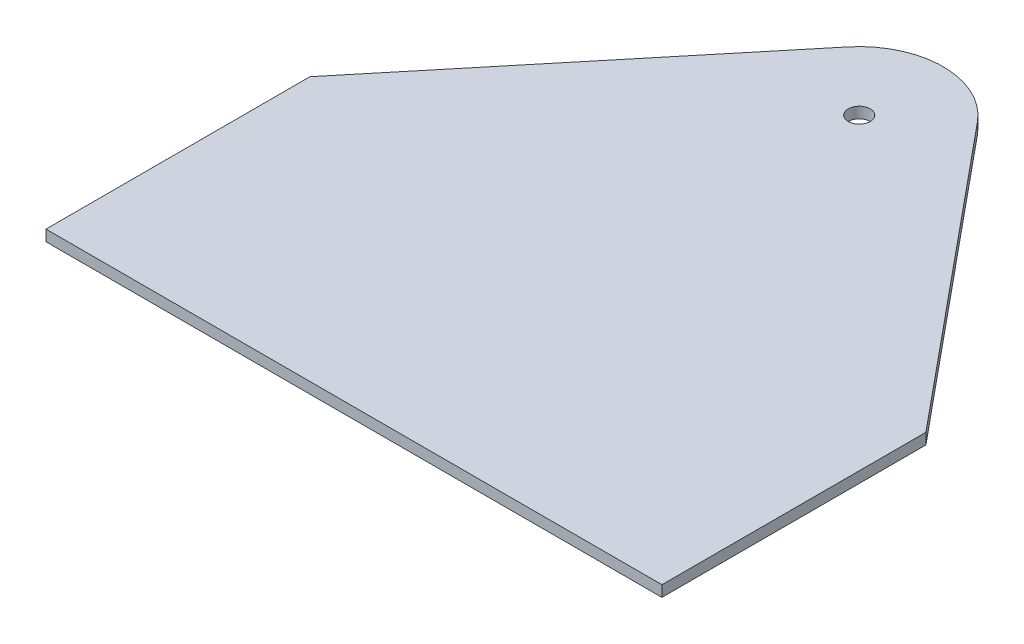
ISO-10303-21;
HEADER;
FILE_DESCRIPTION(('STEP AP214'),'2;1');
FILE_NAME('part.step','',(''),(''),'','','');
FILE_SCHEMA(('AUTOMOTIVE_DESIGN { 1 0 10303 214 1 1 1 1 }'));
ENDSEC;
DATA;
#1=APPLICATION_CONTEXT('core data for automotive mechanical design processes');
#2=APPLICATION_PROTOCOL_DEFINITION('international standard','automotive_design',2000,#1);
#3=PRODUCT_CONTEXT('',#1,'mechanical');
#4=PRODUCT('Part','Part','',(#3));
#5=PRODUCT_RELATED_PRODUCT_CATEGORY('part','',(#4));
#6=PRODUCT_DEFINITION_FORMATION('','',#4);
#7=PRODUCT_DEFINITION_CONTEXT('part definition',#1,'design');
#8=PRODUCT_DEFINITION('design','',#6,#7);
#9=PRODUCT_DEFINITION_SHAPE('','',#8);
#10=(LENGTH_UNIT() NAMED_UNIT(*) SI_UNIT(.MILLI.,.METRE.));
#11=(NAMED_UNIT(*) PLANE_ANGLE_UNIT() SI_UNIT($,.RADIAN.));
#12=(NAMED_UNIT(*) SI_UNIT($,.STERADIAN.) SOLID_ANGLE_UNIT());
#13=UNCERTAINTY_MEASURE_WITH_UNIT(LENGTH_MEASURE(1.E-05),#10,'distance_accuracy_value','');
#14=(GEOMETRIC_REPRESENTATION_CONTEXT(3) GLOBAL_UNCERTAINTY_ASSIGNED_CONTEXT((#13)) GLOBAL_UNIT_ASSIGNED_CONTEXT((#10,
#11,#12)) REPRESENTATION_CONTEXT('',''));
#15=CARTESIAN_POINT('',(0.,0.,0.));
#16=DIRECTION('',(0.,0.,1.));
#17=DIRECTION('',(1.,0.,0.));
#18=AXIS2_PLACEMENT_3D('',#15,#16,#17);
#19=CARTESIAN_POINT('',(0.,3.175,-145.86307345283));
#20=DIRECTION('',(0.,-1.,0.));
#21=DIRECTION('',(0.,0.,-1.));
#22=AXIS2_PLACEMENT_3D('',#19,#20,#21);
#23=PLANE('',#22);
#24=DIRECTION('',(0.,0.,-1.));
#25=VECTOR('',#24,1.);
#26=CARTESIAN_POINT('',(88.9,3.175,0.));
#27=LINE('',#26,#25);
#28=CARTESIAN_POINT('',(88.9,3.175,0.));
#29=VERTEX_POINT('',#28);
#30=CARTESIAN_POINT('',(88.9,3.175,-76.2));
#31=VERTEX_POINT('',#30);
#32=EDGE_CURVE('E128',#29,#31,#27,.T.);
#33=ORIENTED_EDGE('',*,*,#32,.T.);
#34=DIRECTION('',(-0.636363636363636,0.,-0.77138921583987));
#35=VECTOR('',#34,1.);
#36=CARTESIAN_POINT('',(18.7026821694994,3.175,-161.291999072665));
#37=LINE('',#36,#35);
#38=CARTESIAN_POINT('',(18.7026821694994,3.175,-161.291999072665));
#39=VERTEX_POINT('',#38);
#40=EDGE_CURVE('E86',#31,#39,#37,.T.);
#41=ORIENTED_EDGE('',*,*,#40,.T.);
#42=CARTESIAN_POINT('',(0.,3.175,-145.86307345283));
#43=DIRECTION('',(0.,1.,0.));
#44=DIRECTION('',(0.,0.,-1.));
#45=AXIS2_PLACEMENT_3D('',#42,#43,#44);
#46=CIRCLE('',#45,24.2454545454546);
#47=CARTESIAN_POINT('',(-18.7026821694994,3.175,-161.291999072665));
#48=VERTEX_POINT('',#47);
#49=EDGE_CURVE('E99',#39,#48,#46,.T.);
#50=ORIENTED_EDGE('',*,*,#49,.T.);
#51=DIRECTION('',(-0.636363636363636,0.,0.77138921583987));
#52=VECTOR('',#51,1.);
#53=CARTESIAN_POINT('',(-88.9,3.175,-76.2));
#54=LINE('',#53,#52);
#55=CARTESIAN_POINT('',(-88.9,3.175,-76.2));
#56=VERTEX_POINT('',#55);
#57=EDGE_CURVE('E93',#48,#56,#54,.T.);
#58=ORIENTED_EDGE('',*,*,#57,.T.);
#59=DIRECTION('',(0.,0.,1.));
#60=VECTOR('',#59,1.);
#61=CARTESIAN_POINT('',(-88.9,3.175,0.));
#62=LINE('',#61,#60);
#63=CARTESIAN_POINT('',(-88.9,3.175,0.));
#64=VERTEX_POINT('',#63);
#65=EDGE_CURVE('E97',#56,#64,#62,.T.);
#66=ORIENTED_EDGE('',*,*,#65,.T.);
#67=DIRECTION('',(1.,0.,0.));
#68=VECTOR('',#67,1.);
#69=CARTESIAN_POINT('',(-88.9,3.175,0.));
#70=LINE('',#69,#68);
#71=EDGE_CURVE('E49',#64,#29,#70,.T.);
#72=ORIENTED_EDGE('',*,*,#71,.T.);
#73=EDGE_LOOP('',(#33,#41,#50,#58,#66,#72));
#74=FACE_BOUND('',#73,.T.);
#75=CARTESIAN_POINT('',(0.,3.175,-145.86307345283));
#76=DIRECTION('',(0.,1.,0.));
#77=DIRECTION('',(0.,0.,1.));
#78=AXIS2_PLACEMENT_3D('',#75,#76,#77);
#79=CIRCLE('',#78,3.175);
#80=CARTESIAN_POINT('',(0.,3.175,-142.68807345283));
#81=VERTEX_POINT('',#80);
#82=EDGE_CURVE('E121',#81,#81,#79,.T.);
#83=ORIENTED_EDGE('',*,*,#82,.F.);
#84=EDGE_LOOP('',(#83));
#85=FACE_BOUND('',#84,.T.);
#86=ADVANCED_FACE('F32',(#74,#85),#23,.F.);
#87=CARTESIAN_POINT('',(0.,0.,-145.86307345283));
#88=DIRECTION('',(0.,-1.,0.));
#89=DIRECTION('',(0.,0.,-1.));
#90=AXIS2_PLACEMENT_3D('',#87,#88,#89);
#91=PLANE('',#90);
#92=DIRECTION('',(0.,0.,-1.));
#93=VECTOR('',#92,1.);
#94=CARTESIAN_POINT('',(88.9,0.,0.));
#95=LINE('',#94,#93);
#96=CARTESIAN_POINT('',(88.9,0.,0.));
#97=VERTEX_POINT('',#96);
#98=CARTESIAN_POINT('',(88.9,0.,-76.2));
#99=VERTEX_POINT('',#98);
#100=EDGE_CURVE('E117',#97,#99,#95,.T.);
#101=ORIENTED_EDGE('',*,*,#100,.F.);
#102=DIRECTION('',(1.,0.,0.));
#103=VECTOR('',#102,1.);
#104=CARTESIAN_POINT('',(-88.9,0.,0.));
#105=LINE('',#104,#103);
#106=CARTESIAN_POINT('',(-88.9,0.,0.));
#107=VERTEX_POINT('',#106);
#108=EDGE_CURVE('E78',#107,#97,#105,.T.);
#109=ORIENTED_EDGE('',*,*,#108,.F.);
#110=DIRECTION('',(0.,0.,1.));
#111=VECTOR('',#110,1.);
#112=CARTESIAN_POINT('',(-88.9,0.,0.));
#113=LINE('',#112,#111);
#114=CARTESIAN_POINT('',(-88.9,0.,-76.2));
#115=VERTEX_POINT('',#114);
#116=EDGE_CURVE('E72',#115,#107,#113,.T.);
#117=ORIENTED_EDGE('',*,*,#116,.F.);
#118=DIRECTION('',(-0.636363636363636,0.,0.77138921583987));
#119=VECTOR('',#118,1.);
#120=CARTESIAN_POINT('',(-88.9,0.,-76.2));
#121=LINE('',#120,#119);
#122=CARTESIAN_POINT('',(-18.7026821694994,0.,-161.291999072665));
#123=VERTEX_POINT('',#122);
#124=EDGE_CURVE('E107',#123,#115,#121,.T.);
#125=ORIENTED_EDGE('',*,*,#124,.F.);
#126=CARTESIAN_POINT('',(0.,0.,-145.86307345283));
#127=DIRECTION('',(0.,1.,0.));
#128=DIRECTION('',(0.,0.,-1.));
#129=AXIS2_PLACEMENT_3D('',#126,#127,#128);
#130=CIRCLE('',#129,24.2454545454546);
#131=CARTESIAN_POINT('',(18.7026821694994,0.,-161.291999072665));
#132=VERTEX_POINT('',#131);
#133=EDGE_CURVE('E123',#132,#123,#130,.T.);
#134=ORIENTED_EDGE('',*,*,#133,.F.);
#135=DIRECTION('',(-0.636363636363636,0.,-0.77138921583987));
#136=VECTOR('',#135,1.);
#137=CARTESIAN_POINT('',(18.7026821694994,0.,-161.291999072665));
#138=LINE('',#137,#136);
#139=EDGE_CURVE('E120',#99,#132,#138,.T.);
#140=ORIENTED_EDGE('',*,*,#139,.F.);
#141=EDGE_LOOP('',(#101,#109,#117,#125,#134,#140));
#142=FACE_BOUND('',#141,.T.);
#143=CARTESIAN_POINT('',(0.,0.,-145.86307345283));
#144=DIRECTION('',(0.,1.,0.));
#145=DIRECTION('',(0.,0.,1.));
#146=AXIS2_PLACEMENT_3D('',#143,#144,#145);
#147=CIRCLE('',#146,3.175);
#148=CARTESIAN_POINT('',(0.,0.,-142.68807345283));
#149=VERTEX_POINT('',#148);
#150=EDGE_CURVE('E221',#149,#149,#147,.T.);
#151=ORIENTED_EDGE('',*,*,#150,.T.);
#152=EDGE_LOOP('',(#151));
#153=FACE_BOUND('',#152,.T.);
#154=ADVANCED_FACE('F137',(#142,#153),#91,.T.);
#155=CARTESIAN_POINT('',(88.9,3.175,0.));
#156=DIRECTION('',(-1.,0.,0.));
#157=DIRECTION('',(0.,0.,1.));
#158=AXIS2_PLACEMENT_3D('',#155,#156,#157);
#159=PLANE('',#158);
#160=ORIENTED_EDGE('',*,*,#100,.T.);
#161=DIRECTION('',(0.,-1.,0.));
#162=VECTOR('',#161,1.);
#163=CARTESIAN_POINT('',(88.9,3.175,-76.2));
#164=LINE('',#163,#162);
#165=EDGE_CURVE('E11',#31,#99,#164,.T.);
#166=ORIENTED_EDGE('',*,*,#165,.F.);
#167=ORIENTED_EDGE('',*,*,#32,.F.);
#168=DIRECTION('',(0.,-1.,0.));
#169=VECTOR('',#168,1.);
#170=CARTESIAN_POINT('',(88.9,3.175,0.));
#171=LINE('',#170,#169);
#172=EDGE_CURVE('E113',#29,#97,#171,.T.);
#173=ORIENTED_EDGE('',*,*,#172,.T.);
#174=EDGE_LOOP('',(#160,#166,#167,#173));
#175=FACE_BOUND('',#174,.T.);
#176=ADVANCED_FACE('F34',(#175),#159,.F.);
#177=CARTESIAN_POINT('',(18.7026821694994,3.175,-161.291999072665));
#178=DIRECTION('',(-0.77138921583987,0.,0.636363636363636));
#179=DIRECTION('',(0.636363636363636,0.,0.77138921583987));
#180=AXIS2_PLACEMENT_3D('',#177,#178,#179);
#181=PLANE('',#180);
#182=ORIENTED_EDGE('',*,*,#139,.T.);
#183=DIRECTION('',(0.,-1.,0.));
#184=VECTOR('',#183,1.);
#185=CARTESIAN_POINT('',(18.7026821694994,3.175,-161.291999072665));
#186=LINE('',#185,#184);
#187=EDGE_CURVE('E41',#39,#132,#186,.T.);
#188=ORIENTED_EDGE('',*,*,#187,.F.);
#189=ORIENTED_EDGE('',*,*,#40,.F.);
#190=ORIENTED_EDGE('',*,*,#165,.T.);
#191=EDGE_LOOP('',(#182,#188,#189,#190));
#192=FACE_BOUND('',#191,.T.);
#193=ADVANCED_FACE('F162',(#192),#181,.F.);
#194=CARTESIAN_POINT('',(0.,3.175,-145.86307345283));
#195=DIRECTION('',(0.,-1.,0.));
#196=DIRECTION('',(0.,0.,-1.));
#197=AXIS2_PLACEMENT_3D('',#194,#195,#196);
#198=CYLINDRICAL_SURFACE('',#197,24.2454545454546);
#199=ORIENTED_EDGE('',*,*,#133,.T.);
#200=DIRECTION('',(0.,-1.,0.));
#201=VECTOR('',#200,1.);
#202=CARTESIAN_POINT('',(-18.7026821694994,3.175,-161.291999072665));
#203=LINE('',#202,#201);
#204=EDGE_CURVE('E108',#48,#123,#203,.T.);
#205=ORIENTED_EDGE('',*,*,#204,.F.);
#206=ORIENTED_EDGE('',*,*,#49,.F.);
#207=ORIENTED_EDGE('',*,*,#187,.T.);
#208=EDGE_LOOP('',(#199,#205,#206,#207));
#209=FACE_BOUND('',#208,.T.);
#210=ADVANCED_FACE('F134',(#209),#198,.T.);
#211=CARTESIAN_POINT('',(-88.9,3.175,-76.2));
#212=DIRECTION('',(0.77138921583987,0.,0.636363636363636));
#213=DIRECTION('',(0.636363636363636,0.,-0.771389215839871));
#214=AXIS2_PLACEMENT_3D('',#211,#212,#213);
#215=PLANE('',#214);
#216=ORIENTED_EDGE('',*,*,#124,.T.);
#217=DIRECTION('',(0.,-1.,0.));
#218=VECTOR('',#217,1.);
#219=CARTESIAN_POINT('',(-88.9,3.175,-76.2));
#220=LINE('',#219,#218);
#221=EDGE_CURVE('E104',#56,#115,#220,.T.);
#222=ORIENTED_EDGE('',*,*,#221,.F.);
#223=ORIENTED_EDGE('',*,*,#57,.F.);
#224=ORIENTED_EDGE('',*,*,#204,.T.);
#225=EDGE_LOOP('',(#216,#222,#223,#224));
#226=FACE_BOUND('',#225,.T.);
#227=ADVANCED_FACE('F105',(#226),#215,.F.);
#228=CARTESIAN_POINT('',(-88.9,3.175,0.));
#229=DIRECTION('',(1.,0.,0.));
#230=DIRECTION('',(0.,0.,-1.));
#231=AXIS2_PLACEMENT_3D('',#228,#229,#230);
#232=PLANE('',#231);
#233=ORIENTED_EDGE('',*,*,#116,.T.);
#234=DIRECTION('',(0.,-1.,0.));
#235=VECTOR('',#234,1.);
#236=CARTESIAN_POINT('',(-88.9,3.175,0.));
#237=LINE('',#236,#235);
#238=EDGE_CURVE('E109',#64,#107,#237,.T.);
#239=ORIENTED_EDGE('',*,*,#238,.F.);
#240=ORIENTED_EDGE('',*,*,#65,.F.);
#241=ORIENTED_EDGE('',*,*,#221,.T.);
#242=EDGE_LOOP('',(#233,#239,#240,#241));
#243=FACE_BOUND('',#242,.T.);
#244=ADVANCED_FACE('F111',(#243),#232,.F.);
#245=CARTESIAN_POINT('',(-88.9,3.175,0.));
#246=DIRECTION('',(0.,0.,-1.));
#247=DIRECTION('',(-1.,0.,0.));
#248=AXIS2_PLACEMENT_3D('',#245,#246,#247);
#249=PLANE('',#248);
#250=ORIENTED_EDGE('',*,*,#108,.T.);
#251=ORIENTED_EDGE('',*,*,#172,.F.);
#252=ORIENTED_EDGE('',*,*,#71,.F.);
#253=ORIENTED_EDGE('',*,*,#238,.T.);
#254=EDGE_LOOP('',(#250,#251,#252,#253));
#255=FACE_BOUND('',#254,.T.);
#256=ADVANCED_FACE('F142',(#255),#249,.F.);
#257=CARTESIAN_POINT('',(0.,3.175,-145.86307345283));
#258=DIRECTION('',(0.,-1.,0.));
#259=DIRECTION('',(0.,0.,-1.));
#260=AXIS2_PLACEMENT_3D('',#257,#258,#259);
#261=CYLINDRICAL_SURFACE('',#260,3.175);
#262=ORIENTED_EDGE('',*,*,#82,.T.);
#263=EDGE_LOOP('',(#262));
#264=FACE_BOUND('',#263,.T.);
#265=ORIENTED_EDGE('',*,*,#150,.F.);
#266=EDGE_LOOP('',(#265));
#267=FACE_BOUND('',#266,.T.);
#268=ADVANCED_FACE('F144',(#264,#267),#261,.F.);
#269=CLOSED_SHELL('',(#86,#154,#176,#193,#210,#227,#244,#256,#268));
#270=MANIFOLD_SOLID_BREP('B2',#269);
#271=ADVANCED_BREP_SHAPE_REPRESENTATION('',(#18,#270),#14);
#272=SHAPE_DEFINITION_REPRESENTATION(#9,#271);
ENDSEC;
END-ISO-10303-21;
